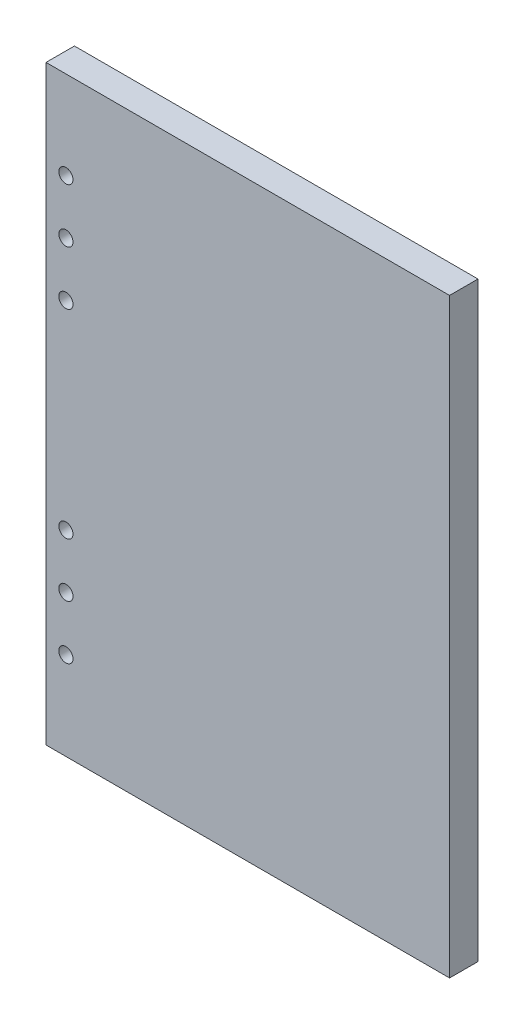
ISO-10303-21;
HEADER;
FILE_DESCRIPTION(('STEP AP214'),'2;1');
FILE_NAME('part.step','',(''),(''),'','','');
FILE_SCHEMA(('AUTOMOTIVE_DESIGN { 1 0 10303 214 1 1 1 1 }'));
ENDSEC;
DATA;
#1=APPLICATION_CONTEXT('core data for automotive mechanical design processes');
#2=APPLICATION_PROTOCOL_DEFINITION('international standard','automotive_design',2000,#1);
#3=PRODUCT_CONTEXT('',#1,'mechanical');
#4=PRODUCT('Part','Part','',(#3));
#5=PRODUCT_RELATED_PRODUCT_CATEGORY('part','',(#4));
#6=PRODUCT_DEFINITION_FORMATION('','',#4);
#7=PRODUCT_DEFINITION_CONTEXT('part definition',#1,'design');
#8=PRODUCT_DEFINITION('design','',#6,#7);
#9=PRODUCT_DEFINITION_SHAPE('','',#8);
#10=(LENGTH_UNIT() NAMED_UNIT(*) SI_UNIT(.MILLI.,.METRE.));
#11=(NAMED_UNIT(*) PLANE_ANGLE_UNIT() SI_UNIT($,.RADIAN.));
#12=(NAMED_UNIT(*) SI_UNIT($,.STERADIAN.) SOLID_ANGLE_UNIT());
#13=UNCERTAINTY_MEASURE_WITH_UNIT(LENGTH_MEASURE(1.E-05),#10,'distance_accuracy_value','');
#14=(GEOMETRIC_REPRESENTATION_CONTEXT(3) GLOBAL_UNCERTAINTY_ASSIGNED_CONTEXT((#13)) GLOBAL_UNIT_ASSIGNED_CONTEXT((#10,
#11,#12)) REPRESENTATION_CONTEXT('',''));
#15=CARTESIAN_POINT('',(0.,0.,0.));
#16=DIRECTION('',(0.,0.,1.));
#17=DIRECTION('',(1.,0.,0.));
#18=AXIS2_PLACEMENT_3D('',#15,#16,#17);
#19=CARTESIAN_POINT('',(0.,0.,10.));
#20=DIRECTION('',(0.,0.,-1.));
#21=DIRECTION('',(-1.,0.,0.));
#22=AXIS2_PLACEMENT_3D('',#19,#20,#21);
#23=PLANE('',#22);
#24=DIRECTION('',(0.,-1.,0.));
#25=VECTOR('',#24,1.);
#26=CARTESIAN_POINT('',(0.,0.,10.));
#27=LINE('',#26,#25);
#28=CARTESIAN_POINT('',(0.,208.,10.));
#29=VERTEX_POINT('',#28);
#30=CARTESIAN_POINT('',(0.,0.,10.));
#31=VERTEX_POINT('',#30);
#32=EDGE_CURVE('E85',#29,#31,#27,.T.);
#33=ORIENTED_EDGE('',*,*,#32,.T.);
#34=DIRECTION('',(1.,0.,0.));
#35=VECTOR('',#34,1.);
#36=CARTESIAN_POINT('',(0.,0.,10.));
#37=LINE('',#36,#35);
#38=CARTESIAN_POINT('',(142.,0.,10.));
#39=VERTEX_POINT('',#38);
#40=EDGE_CURVE('E80',#31,#39,#37,.T.);
#41=ORIENTED_EDGE('',*,*,#40,.T.);
#42=DIRECTION('',(0.,1.,0.));
#43=VECTOR('',#42,1.);
#44=CARTESIAN_POINT('',(142.,0.,10.));
#45=LINE('',#44,#43);
#46=CARTESIAN_POINT('',(142.,208.,10.));
#47=VERTEX_POINT('',#46);
#48=EDGE_CURVE('E83',#39,#47,#45,.T.);
#49=ORIENTED_EDGE('',*,*,#48,.T.);
#50=DIRECTION('',(-1.,0.,0.));
#51=VECTOR('',#50,1.);
#52=CARTESIAN_POINT('',(0.,208.,10.));
#53=LINE('',#52,#51);
#54=EDGE_CURVE('E50',#47,#29,#53,.T.);
#55=ORIENTED_EDGE('',*,*,#54,.T.);
#56=EDGE_LOOP('',(#33,#41,#49,#55));
#57=FACE_BOUND('',#56,.T.);
#58=CARTESIAN_POINT('',(7.,139.,10.));
#59=DIRECTION('',(0.,0.,1.));
#60=DIRECTION('',(1.,0.,0.));
#61=AXIS2_PLACEMENT_3D('',#58,#59,#60);
#62=CIRCLE('',#61,2.5);
#63=CARTESIAN_POINT('',(9.5,139.,10.));
#64=VERTEX_POINT('',#63);
#65=EDGE_CURVE('E100',#64,#64,#62,.T.);
#66=ORIENTED_EDGE('',*,*,#65,.F.);
#67=EDGE_LOOP('',(#66));
#68=FACE_BOUND('',#67,.T.);
#69=CARTESIAN_POINT('',(7.,158.,10.));
#70=DIRECTION('',(0.,0.,1.));
#71=DIRECTION('',(1.,0.,0.));
#72=AXIS2_PLACEMENT_3D('',#69,#70,#71);
#73=CIRCLE('',#72,2.5);
#74=CARTESIAN_POINT('',(9.5,158.,10.));
#75=VERTEX_POINT('',#74);
#76=EDGE_CURVE('E115',#75,#75,#73,.T.);
#77=ORIENTED_EDGE('',*,*,#76,.F.);
#78=EDGE_LOOP('',(#77));
#79=FACE_BOUND('',#78,.T.);
#80=CARTESIAN_POINT('',(7.,177.,10.));
#81=DIRECTION('',(0.,0.,1.));
#82=DIRECTION('',(1.,0.,0.));
#83=AXIS2_PLACEMENT_3D('',#80,#81,#82);
#84=CIRCLE('',#83,2.5);
#85=CARTESIAN_POINT('',(9.5,177.,10.));
#86=VERTEX_POINT('',#85);
#87=EDGE_CURVE('E121',#86,#86,#84,.T.);
#88=ORIENTED_EDGE('',*,*,#87,.F.);
#89=EDGE_LOOP('',(#88));
#90=FACE_BOUND('',#89,.T.);
#91=CARTESIAN_POINT('',(7.,31.,10.));
#92=DIRECTION('',(0.,0.,1.));
#93=DIRECTION('',(-1.,0.,0.));
#94=AXIS2_PLACEMENT_3D('',#91,#92,#93);
#95=CIRCLE('',#94,2.5);
#96=CARTESIAN_POINT('',(4.5,31.,10.));
#97=VERTEX_POINT('',#96);
#98=EDGE_CURVE('E127',#97,#97,#95,.T.);
#99=ORIENTED_EDGE('',*,*,#98,.F.);
#100=EDGE_LOOP('',(#99));
#101=FACE_BOUND('',#100,.T.);
#102=CARTESIAN_POINT('',(7.,50.,10.));
#103=DIRECTION('',(0.,0.,1.));
#104=DIRECTION('',(-1.,0.,0.));
#105=AXIS2_PLACEMENT_3D('',#102,#103,#104);
#106=CIRCLE('',#105,2.5);
#107=CARTESIAN_POINT('',(4.5,50.,10.));
#108=VERTEX_POINT('',#107);
#109=EDGE_CURVE('E133',#108,#108,#106,.T.);
#110=ORIENTED_EDGE('',*,*,#109,.F.);
#111=EDGE_LOOP('',(#110));
#112=FACE_BOUND('',#111,.T.);
#113=CARTESIAN_POINT('',(7.,69.,10.));
#114=DIRECTION('',(0.,0.,1.));
#115=DIRECTION('',(-1.,0.,0.));
#116=AXIS2_PLACEMENT_3D('',#113,#114,#115);
#117=CIRCLE('',#116,2.5);
#118=CARTESIAN_POINT('',(4.5,69.,10.));
#119=VERTEX_POINT('',#118);
#120=EDGE_CURVE('E139',#119,#119,#117,.T.);
#121=ORIENTED_EDGE('',*,*,#120,.F.);
#122=EDGE_LOOP('',(#121));
#123=FACE_BOUND('',#122,.T.);
#124=ADVANCED_FACE('F33',(#57,#68,#79,#90,#101,#112,#123),#23,.F.);
#125=CARTESIAN_POINT('',(0.,0.,0.));
#126=DIRECTION('',(0.,0.,-1.));
#127=DIRECTION('',(-1.,0.,0.));
#128=AXIS2_PLACEMENT_3D('',#125,#126,#127);
#129=PLANE('',#128);
#130=CARTESIAN_POINT('',(7.,50.,0.));
#131=DIRECTION('',(0.,0.,1.));
#132=DIRECTION('',(-1.,0.,0.));
#133=AXIS2_PLACEMENT_3D('',#130,#131,#132);
#134=CIRCLE('',#133,2.5);
#135=CARTESIAN_POINT('',(4.5,50.,0.));
#136=VERTEX_POINT('',#135);
#137=EDGE_CURVE('E136',#136,#136,#134,.T.);
#138=ORIENTED_EDGE('',*,*,#137,.T.);
#139=EDGE_LOOP('',(#138));
#140=FACE_BOUND('',#139,.T.);
#141=CARTESIAN_POINT('',(7.,177.,0.));
#142=DIRECTION('',(0.,0.,1.));
#143=DIRECTION('',(1.,0.,0.));
#144=AXIS2_PLACEMENT_3D('',#141,#142,#143);
#145=CIRCLE('',#144,2.5);
#146=CARTESIAN_POINT('',(9.5,177.,0.));
#147=VERTEX_POINT('',#146);
#148=EDGE_CURVE('E124',#147,#147,#145,.T.);
#149=ORIENTED_EDGE('',*,*,#148,.T.);
#150=EDGE_LOOP('',(#149));
#151=FACE_BOUND('',#150,.T.);
#152=CARTESIAN_POINT('',(7.,139.,0.));
#153=DIRECTION('',(0.,0.,1.));
#154=DIRECTION('',(1.,0.,0.));
#155=AXIS2_PLACEMENT_3D('',#152,#153,#154);
#156=CIRCLE('',#155,2.5);
#157=CARTESIAN_POINT('',(9.5,139.,0.));
#158=VERTEX_POINT('',#157);
#159=EDGE_CURVE('E112',#158,#158,#156,.T.);
#160=ORIENTED_EDGE('',*,*,#159,.T.);
#161=EDGE_LOOP('',(#160));
#162=FACE_BOUND('',#161,.T.);
#163=DIRECTION('',(0.,-1.,0.));
#164=VECTOR('',#163,1.);
#165=CARTESIAN_POINT('',(0.,0.,0.));
#166=LINE('',#165,#164);
#167=CARTESIAN_POINT('',(0.,208.,0.));
#168=VERTEX_POINT('',#167);
#169=CARTESIAN_POINT('',(0.,0.,0.));
#170=VERTEX_POINT('',#169);
#171=EDGE_CURVE('E97',#168,#170,#166,.T.);
#172=ORIENTED_EDGE('',*,*,#171,.F.);
#173=DIRECTION('',(-1.,0.,0.));
#174=VECTOR('',#173,1.);
#175=CARTESIAN_POINT('',(0.,208.,0.));
#176=LINE('',#175,#174);
#177=CARTESIAN_POINT('',(142.,208.,0.));
#178=VERTEX_POINT('',#177);
#179=EDGE_CURVE('E73',#178,#168,#176,.T.);
#180=ORIENTED_EDGE('',*,*,#179,.F.);
#181=DIRECTION('',(0.,1.,0.));
#182=VECTOR('',#181,1.);
#183=CARTESIAN_POINT('',(142.,0.,0.));
#184=LINE('',#183,#182);
#185=CARTESIAN_POINT('',(142.,0.,0.));
#186=VERTEX_POINT('',#185);
#187=EDGE_CURVE('E67',#186,#178,#184,.T.);
#188=ORIENTED_EDGE('',*,*,#187,.F.);
#189=DIRECTION('',(1.,0.,0.));
#190=VECTOR('',#189,1.);
#191=CARTESIAN_POINT('',(0.,0.,0.));
#192=LINE('',#191,#190);
#193=EDGE_CURVE('E89',#170,#186,#192,.T.);
#194=ORIENTED_EDGE('',*,*,#193,.F.);
#195=EDGE_LOOP('',(#172,#180,#188,#194));
#196=FACE_BOUND('',#195,.T.);
#197=CARTESIAN_POINT('',(7.,158.,0.));
#198=DIRECTION('',(0.,0.,1.));
#199=DIRECTION('',(1.,0.,0.));
#200=AXIS2_PLACEMENT_3D('',#197,#198,#199);
#201=CIRCLE('',#200,2.5);
#202=CARTESIAN_POINT('',(9.5,158.,0.));
#203=VERTEX_POINT('',#202);
#204=EDGE_CURVE('E118',#203,#203,#201,.T.);
#205=ORIENTED_EDGE('',*,*,#204,.T.);
#206=EDGE_LOOP('',(#205));
#207=FACE_BOUND('',#206,.T.);
#208=CARTESIAN_POINT('',(7.,31.,0.));
#209=DIRECTION('',(0.,0.,1.));
#210=DIRECTION('',(-1.,0.,0.));
#211=AXIS2_PLACEMENT_3D('',#208,#209,#210);
#212=CIRCLE('',#211,2.5);
#213=CARTESIAN_POINT('',(4.5,31.,0.));
#214=VERTEX_POINT('',#213);
#215=EDGE_CURVE('E130',#214,#214,#212,.T.);
#216=ORIENTED_EDGE('',*,*,#215,.T.);
#217=EDGE_LOOP('',(#216));
#218=FACE_BOUND('',#217,.T.);
#219=CARTESIAN_POINT('',(7.,69.,0.));
#220=DIRECTION('',(0.,0.,1.));
#221=DIRECTION('',(-1.,0.,0.));
#222=AXIS2_PLACEMENT_3D('',#219,#220,#221);
#223=CIRCLE('',#222,2.5);
#224=CARTESIAN_POINT('',(4.5,69.,0.));
#225=VERTEX_POINT('',#224);
#226=EDGE_CURVE('E142',#225,#225,#223,.T.);
#227=ORIENTED_EDGE('',*,*,#226,.T.);
#228=EDGE_LOOP('',(#227));
#229=FACE_BOUND('',#228,.T.);
#230=ADVANCED_FACE('F108',(#140,#151,#162,#196,#207,#218,#229),#129,.T.);
#231=CARTESIAN_POINT('',(0.,0.,10.));
#232=DIRECTION('',(1.,0.,0.));
#233=DIRECTION('',(0.,0.,-1.));
#234=AXIS2_PLACEMENT_3D('',#231,#232,#233);
#235=PLANE('',#234);
#236=ORIENTED_EDGE('',*,*,#171,.T.);
#237=DIRECTION('',(0.,0.,-1.));
#238=VECTOR('',#237,1.);
#239=CARTESIAN_POINT('',(0.,0.,10.));
#240=LINE('',#239,#238);
#241=EDGE_CURVE('E11',#31,#170,#240,.T.);
#242=ORIENTED_EDGE('',*,*,#241,.F.);
#243=ORIENTED_EDGE('',*,*,#32,.F.);
#244=DIRECTION('',(0.,0.,-1.));
#245=VECTOR('',#244,1.);
#246=CARTESIAN_POINT('',(0.,208.,10.));
#247=LINE('',#246,#245);
#248=EDGE_CURVE('E93',#29,#168,#247,.T.);
#249=ORIENTED_EDGE('',*,*,#248,.T.);
#250=EDGE_LOOP('',(#236,#242,#243,#249));
#251=FACE_BOUND('',#250,.T.);
#252=ADVANCED_FACE('F35',(#251),#235,.F.);
#253=CARTESIAN_POINT('',(0.,0.,10.));
#254=DIRECTION('',(0.,1.,0.));
#255=DIRECTION('',(0.,0.,1.));
#256=AXIS2_PLACEMENT_3D('',#253,#254,#255);
#257=PLANE('',#256);
#258=ORIENTED_EDGE('',*,*,#193,.T.);
#259=DIRECTION('',(0.,0.,-1.));
#260=VECTOR('',#259,1.);
#261=CARTESIAN_POINT('',(142.,0.,10.));
#262=LINE('',#261,#260);
#263=EDGE_CURVE('E42',#39,#186,#262,.T.);
#264=ORIENTED_EDGE('',*,*,#263,.F.);
#265=ORIENTED_EDGE('',*,*,#40,.F.);
#266=ORIENTED_EDGE('',*,*,#241,.T.);
#267=EDGE_LOOP('',(#258,#264,#265,#266));
#268=FACE_BOUND('',#267,.T.);
#269=ADVANCED_FACE('F88',(#268),#257,.F.);
#270=CARTESIAN_POINT('',(142.,0.,10.));
#271=DIRECTION('',(-1.,0.,0.));
#272=DIRECTION('',(0.,0.,1.));
#273=AXIS2_PLACEMENT_3D('',#270,#271,#272);
#274=PLANE('',#273);
#275=ORIENTED_EDGE('',*,*,#187,.T.);
#276=DIRECTION('',(0.,0.,-1.));
#277=VECTOR('',#276,1.);
#278=CARTESIAN_POINT('',(142.,208.,10.));
#279=LINE('',#278,#277);
#280=EDGE_CURVE('E90',#47,#178,#279,.T.);
#281=ORIENTED_EDGE('',*,*,#280,.F.);
#282=ORIENTED_EDGE('',*,*,#48,.F.);
#283=ORIENTED_EDGE('',*,*,#263,.T.);
#284=EDGE_LOOP('',(#275,#281,#282,#283));
#285=FACE_BOUND('',#284,.T.);
#286=ADVANCED_FACE('F91',(#285),#274,.F.);
#287=CARTESIAN_POINT('',(0.,208.,10.));
#288=DIRECTION('',(0.,-1.,0.));
#289=DIRECTION('',(0.,0.,-1.));
#290=AXIS2_PLACEMENT_3D('',#287,#288,#289);
#291=PLANE('',#290);
#292=ORIENTED_EDGE('',*,*,#179,.T.);
#293=ORIENTED_EDGE('',*,*,#248,.F.);
#294=ORIENTED_EDGE('',*,*,#54,.F.);
#295=ORIENTED_EDGE('',*,*,#280,.T.);
#296=EDGE_LOOP('',(#292,#293,#294,#295));
#297=FACE_BOUND('',#296,.T.);
#298=ADVANCED_FACE('F105',(#297),#291,.F.);
#299=CARTESIAN_POINT('',(7.,139.,10.));
#300=DIRECTION('',(0.,0.,-1.));
#301=DIRECTION('',(-1.,0.,0.));
#302=AXIS2_PLACEMENT_3D('',#299,#300,#301);
#303=CYLINDRICAL_SURFACE('',#302,2.5);
#304=ORIENTED_EDGE('',*,*,#65,.T.);
#305=EDGE_LOOP('',(#304));
#306=FACE_BOUND('',#305,.T.);
#307=ORIENTED_EDGE('',*,*,#159,.F.);
#308=EDGE_LOOP('',(#307));
#309=FACE_BOUND('',#308,.T.);
#310=ADVANCED_FACE('F159',(#306,#309),#303,.F.);
#311=CARTESIAN_POINT('',(7.,158.,10.));
#312=DIRECTION('',(0.,0.,-1.));
#313=DIRECTION('',(-1.,0.,0.));
#314=AXIS2_PLACEMENT_3D('',#311,#312,#313);
#315=CYLINDRICAL_SURFACE('',#314,2.5);
#316=ORIENTED_EDGE('',*,*,#76,.T.);
#317=EDGE_LOOP('',(#316));
#318=FACE_BOUND('',#317,.T.);
#319=ORIENTED_EDGE('',*,*,#204,.F.);
#320=EDGE_LOOP('',(#319));
#321=FACE_BOUND('',#320,.T.);
#322=ADVANCED_FACE('F205',(#318,#321),#315,.F.);
#323=CARTESIAN_POINT('',(7.,177.,10.));
#324=DIRECTION('',(0.,0.,-1.));
#325=DIRECTION('',(-1.,0.,0.));
#326=AXIS2_PLACEMENT_3D('',#323,#324,#325);
#327=CYLINDRICAL_SURFACE('',#326,2.5);
#328=ORIENTED_EDGE('',*,*,#87,.T.);
#329=EDGE_LOOP('',(#328));
#330=FACE_BOUND('',#329,.T.);
#331=ORIENTED_EDGE('',*,*,#148,.F.);
#332=EDGE_LOOP('',(#331));
#333=FACE_BOUND('',#332,.T.);
#334=ADVANCED_FACE('F213',(#330,#333),#327,.F.);
#335=CARTESIAN_POINT('',(7.,31.,10.));
#336=DIRECTION('',(0.,0.,-1.));
#337=DIRECTION('',(-1.,0.,0.));
#338=AXIS2_PLACEMENT_3D('',#335,#336,#337);
#339=CYLINDRICAL_SURFACE('',#338,2.5);
#340=ORIENTED_EDGE('',*,*,#98,.T.);
#341=EDGE_LOOP('',(#340));
#342=FACE_BOUND('',#341,.T.);
#343=ORIENTED_EDGE('',*,*,#215,.F.);
#344=EDGE_LOOP('',(#343));
#345=FACE_BOUND('',#344,.T.);
#346=ADVANCED_FACE('F221',(#342,#345),#339,.F.);
#347=CARTESIAN_POINT('',(7.,50.,10.));
#348=DIRECTION('',(0.,0.,-1.));
#349=DIRECTION('',(-1.,0.,0.));
#350=AXIS2_PLACEMENT_3D('',#347,#348,#349);
#351=CYLINDRICAL_SURFACE('',#350,2.5);
#352=ORIENTED_EDGE('',*,*,#109,.T.);
#353=EDGE_LOOP('',(#352));
#354=FACE_BOUND('',#353,.T.);
#355=ORIENTED_EDGE('',*,*,#137,.F.);
#356=EDGE_LOOP('',(#355));
#357=FACE_BOUND('',#356,.T.);
#358=ADVANCED_FACE('F230',(#354,#357),#351,.F.);
#359=CARTESIAN_POINT('',(7.,69.,10.));
#360=DIRECTION('',(0.,0.,-1.));
#361=DIRECTION('',(-1.,0.,0.));
#362=AXIS2_PLACEMENT_3D('',#359,#360,#361);
#363=CYLINDRICAL_SURFACE('',#362,2.5);
#364=ORIENTED_EDGE('',*,*,#120,.T.);
#365=EDGE_LOOP('',(#364));
#366=FACE_BOUND('',#365,.T.);
#367=ORIENTED_EDGE('',*,*,#226,.F.);
#368=EDGE_LOOP('',(#367));
#369=FACE_BOUND('',#368,.T.);
#370=ADVANCED_FACE('F148',(#366,#369),#363,.F.);
#371=CLOSED_SHELL('',(#124,#230,#252,#269,#286,#298,#310,#322,#334,#346,#358,#370));
#372=MANIFOLD_SOLID_BREP('B2',#371);
#373=ADVANCED_BREP_SHAPE_REPRESENTATION('',(#18,#372),#14);
#374=SHAPE_DEFINITION_REPRESENTATION(#9,#373);
ENDSEC;
END-ISO-10303-21;
